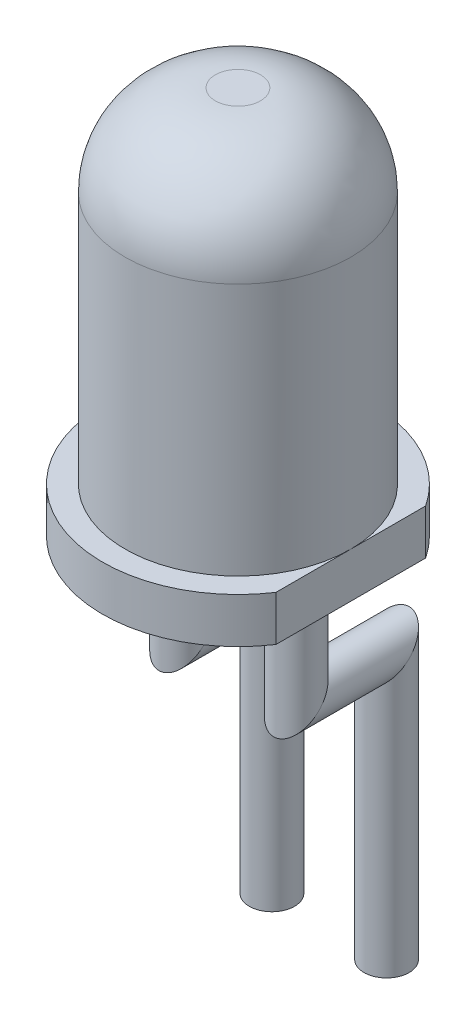
ISO-10303-21;
HEADER;
FILE_DESCRIPTION(('STEP AP214'),'2;1');
FILE_NAME('part.step','',(''),(''),'','','');
FILE_SCHEMA(('AUTOMOTIVE_DESIGN { 1 0 10303 214 1 1 1 1 }'));
ENDSEC;
DATA;
#1=APPLICATION_CONTEXT('core data for automotive mechanical design processes');
#2=APPLICATION_PROTOCOL_DEFINITION('international standard','automotive_design',2000,#1);
#3=PRODUCT_CONTEXT('',#1,'mechanical');
#4=PRODUCT('Part','Part','',(#3));
#5=PRODUCT_RELATED_PRODUCT_CATEGORY('part','',(#4));
#6=PRODUCT_DEFINITION_FORMATION('','',#4);
#7=PRODUCT_DEFINITION_CONTEXT('part definition',#1,'design');
#8=PRODUCT_DEFINITION('design','',#6,#7);
#9=PRODUCT_DEFINITION_SHAPE('','',#8);
#10=(LENGTH_UNIT() NAMED_UNIT(*) SI_UNIT(.MILLI.,.METRE.));
#11=(NAMED_UNIT(*) PLANE_ANGLE_UNIT() SI_UNIT($,.RADIAN.));
#12=(NAMED_UNIT(*) SI_UNIT($,.STERADIAN.) SOLID_ANGLE_UNIT());
#13=UNCERTAINTY_MEASURE_WITH_UNIT(LENGTH_MEASURE(1.E-05),#10,'distance_accuracy_value','');
#14=(GEOMETRIC_REPRESENTATION_CONTEXT(3) GLOBAL_UNCERTAINTY_ASSIGNED_CONTEXT((#13)) GLOBAL_UNIT_ASSIGNED_CONTEXT((#10,
#11,#12)) REPRESENTATION_CONTEXT('',''));
#15=CARTESIAN_POINT('',(0.,0.,0.));
#16=DIRECTION('',(0.,0.,1.));
#17=DIRECTION('',(1.,0.,0.));
#18=AXIS2_PLACEMENT_3D('',#15,#16,#17);
#19=CARTESIAN_POINT('',(0.,6.6,0.));
#20=DIRECTION('',(0.,1.,0.));
#21=DIRECTION('',(0.,0.,1.));
#22=AXIS2_PLACEMENT_3D('',#19,#20,#21);
#23=DEGENERATE_TOROIDAL_SURFACE('',#22,0.5,2.,.T.);
#24=CARTESIAN_POINT('',(0.,8.6,0.));
#25=DIRECTION('',(0.,1.,0.));
#26=DIRECTION('',(0.,0.,1.));
#27=AXIS2_PLACEMENT_3D('',#24,#25,#26);
#28=CIRCLE('',#27,0.5);
#29=CARTESIAN_POINT('',(0.,8.6,0.5));
#30=VERTEX_POINT('',#29);
#31=EDGE_CURVE('E86',#30,#30,#28,.T.);
#32=ORIENTED_EDGE('',*,*,#31,.F.);
#33=EDGE_LOOP('',(#32));
#34=FACE_BOUND('',#33,.T.);
#35=CARTESIAN_POINT('',(0.,6.6,0.));
#36=DIRECTION('',(0.,1.,0.));
#37=DIRECTION('',(0.,0.,1.));
#38=AXIS2_PLACEMENT_3D('',#35,#36,#37);
#39=CIRCLE('',#38,2.5);
#40=CARTESIAN_POINT('',(0.,6.6,2.5));
#41=VERTEX_POINT('',#40);
#42=EDGE_CURVE('E44',#41,#41,#39,.F.);
#43=ORIENTED_EDGE('',*,*,#42,.F.);
#44=EDGE_LOOP('',(#43));
#45=FACE_BOUND('',#44,.T.);
#46=ADVANCED_FACE('F41',(#34,#45),#23,.T.);
#47=CARTESIAN_POINT('',(0.,1.,0.));
#48=DIRECTION('',(0.,-1.,0.));
#49=DIRECTION('',(0.,0.,-1.));
#50=AXIS2_PLACEMENT_3D('',#47,#48,#49);
#51=CYLINDRICAL_SURFACE('',#50,3.);
#52=CARTESIAN_POINT('',(0.,1.,0.));
#53=DIRECTION('',(0.,1.,0.));
#54=DIRECTION('',(0.,0.,1.));
#55=AXIS2_PLACEMENT_3D('',#52,#53,#54);
#56=CIRCLE('',#55,3.);
#57=CARTESIAN_POINT('',(2.5,1.,-1.6583123951777));
#58=VERTEX_POINT('',#57);
#59=CARTESIAN_POINT('',(2.5,1.,1.6583123951777));
#60=VERTEX_POINT('',#59);
#61=EDGE_CURVE('E82',#58,#60,#56,.T.);
#62=ORIENTED_EDGE('',*,*,#61,.F.);
#63=DIRECTION('',(0.,-1.,0.));
#64=VECTOR('',#63,1.);
#65=CARTESIAN_POINT('',(2.5,1.,-1.6583123951777));
#66=LINE('',#65,#64);
#67=CARTESIAN_POINT('',(2.5,0.,-1.6583123951777));
#68=VERTEX_POINT('',#67);
#69=EDGE_CURVE('E62',#58,#68,#66,.T.);
#70=ORIENTED_EDGE('',*,*,#69,.T.);
#71=CARTESIAN_POINT('',(0.,0.,0.));
#72=DIRECTION('',(0.,1.,0.));
#73=DIRECTION('',(0.,0.,1.));
#74=AXIS2_PLACEMENT_3D('',#71,#72,#73);
#75=CIRCLE('',#74,3.);
#76=CARTESIAN_POINT('',(2.5,0.,1.6583123951777));
#77=VERTEX_POINT('',#76);
#78=EDGE_CURVE('E89',#68,#77,#75,.T.);
#79=ORIENTED_EDGE('',*,*,#78,.T.);
#80=DIRECTION('',(0.,-1.,0.));
#81=VECTOR('',#80,1.);
#82=CARTESIAN_POINT('',(2.5,1.,1.6583123951777));
#83=LINE('',#82,#81);
#84=EDGE_CURVE('E56',#77,#60,#83,.F.);
#85=ORIENTED_EDGE('',*,*,#84,.T.);
#86=EDGE_LOOP('',(#62,#70,#79,#85));
#87=FACE_BOUND('',#86,.T.);
#88=ADVANCED_FACE('F120',(#87),#51,.T.);
#89=CARTESIAN_POINT('',(0.,1.,0.));
#90=DIRECTION('',(0.,1.,0.));
#91=DIRECTION('',(0.,0.,1.));
#92=AXIS2_PLACEMENT_3D('',#89,#90,#91);
#93=PLANE('',#92);
#94=DIRECTION('',(0.,0.,1.));
#95=VECTOR('',#94,1.);
#96=CARTESIAN_POINT('',(2.5,1.,0.));
#97=LINE('',#96,#95);
#98=CARTESIAN_POINT('',(2.5,1.,0.));
#99=VERTEX_POINT('',#98);
#100=EDGE_CURVE('E69',#58,#99,#97,.T.);
#101=ORIENTED_EDGE('',*,*,#100,.F.);
#102=ORIENTED_EDGE('',*,*,#61,.T.);
#103=EDGE_CURVE('E72',#99,#60,#97,.T.);
#104=ORIENTED_EDGE('',*,*,#103,.F.);
#105=CARTESIAN_POINT('',(0.,1.,0.));
#106=DIRECTION('',(0.,1.,0.));
#107=DIRECTION('',(0.,0.,1.));
#108=AXIS2_PLACEMENT_3D('',#105,#106,#107);
#109=CIRCLE('',#108,2.5);
#110=EDGE_CURVE('E81',#99,#99,#109,.T.);
#111=ORIENTED_EDGE('',*,*,#110,.F.);
#112=EDGE_LOOP('',(#101,#102,#104,#111));
#113=FACE_BOUND('',#112,.T.);
#114=ADVANCED_FACE('F80',(#113),#93,.T.);
#115=CARTESIAN_POINT('',(0.,0.,0.));
#116=DIRECTION('',(0.,1.,0.));
#117=DIRECTION('',(0.,0.,1.));
#118=AXIS2_PLACEMENT_3D('',#115,#116,#117);
#119=PLANE('',#118);
#120=CARTESIAN_POINT('',(-1.27,0.,-0.0224020782966395));
#121=DIRECTION('',(0.,1.,0.));
#122=DIRECTION('',(0.,0.,-1.));
#123=AXIS2_PLACEMENT_3D('',#120,#121,#122);
#124=CIRCLE('',#123,0.5);
#125=CARTESIAN_POINT('',(-1.27,0.,-0.52240207829664));
#126=VERTEX_POINT('',#125);
#127=EDGE_CURVE('E111',#126,#126,#124,.F.);
#128=ORIENTED_EDGE('',*,*,#127,.F.);
#129=EDGE_LOOP('',(#128));
#130=FACE_BOUND('',#129,.T.);
#131=CARTESIAN_POINT('',(1.27,0.,-0.0224020782966395));
#132=DIRECTION('',(0.,-1.,0.));
#133=DIRECTION('',(0.,0.,-1.));
#134=AXIS2_PLACEMENT_3D('',#131,#132,#133);
#135=CIRCLE('',#134,0.5);
#136=CARTESIAN_POINT('',(1.27,0.,-0.52240207829664));
#137=VERTEX_POINT('',#136);
#138=EDGE_CURVE('E11',#137,#137,#135,.T.);
#139=ORIENTED_EDGE('',*,*,#138,.F.);
#140=EDGE_LOOP('',(#139));
#141=FACE_BOUND('',#140,.T.);
#142=ORIENTED_EDGE('',*,*,#78,.F.);
#143=DIRECTION('',(0.,0.,1.));
#144=VECTOR('',#143,1.);
#145=CARTESIAN_POINT('',(2.5,0.,0.));
#146=LINE('',#145,#144);
#147=EDGE_CURVE('E118',#68,#77,#146,.T.);
#148=ORIENTED_EDGE('',*,*,#147,.T.);
#149=EDGE_LOOP('',(#142,#148));
#150=FACE_BOUND('',#149,.T.);
#151=ADVANCED_FACE('F122',(#130,#141,#150),#119,.F.);
#152=CARTESIAN_POINT('',(0.,8.6,0.));
#153=DIRECTION('',(0.,-1.,0.));
#154=DIRECTION('',(0.,0.,-1.));
#155=AXIS2_PLACEMENT_3D('',#152,#153,#154);
#156=CYLINDRICAL_SURFACE('',#155,2.5);
#157=ORIENTED_EDGE('',*,*,#110,.T.);
#158=EDGE_LOOP('',(#157));
#159=FACE_BOUND('',#158,.T.);
#160=ORIENTED_EDGE('',*,*,#42,.T.);
#161=EDGE_LOOP('',(#160));
#162=FACE_BOUND('',#161,.T.);
#163=ADVANCED_FACE('F84',(#159,#162),#156,.T.);
#164=CARTESIAN_POINT('',(0.,8.6,0.));
#165=DIRECTION('',(0.,1.,0.));
#166=DIRECTION('',(0.,0.,1.));
#167=AXIS2_PLACEMENT_3D('',#164,#165,#166);
#168=PLANE('',#167);
#169=ORIENTED_EDGE('',*,*,#31,.T.);
#170=EDGE_LOOP('',(#169));
#171=FACE_BOUND('',#170,.T.);
#172=ADVANCED_FACE('F130',(#171),#168,.T.);
#173=CARTESIAN_POINT('',(1.27,-8.5,-2.02240207829664));
#174=DIRECTION('',(0.,-1.,0.));
#175=DIRECTION('',(0.,0.,-1.));
#176=AXIS2_PLACEMENT_3D('',#173,#174,#175);
#177=PLANE('',#176);
#178=CARTESIAN_POINT('',(1.27,-8.5,-2.02240207829664));
#179=DIRECTION('',(0.,-1.,0.));
#180=DIRECTION('',(0.,0.,-1.));
#181=AXIS2_PLACEMENT_3D('',#178,#179,#180);
#182=CIRCLE('',#181,0.5);
#183=CARTESIAN_POINT('',(1.27,-8.5,-2.52240207829664));
#184=VERTEX_POINT('',#183);
#185=EDGE_CURVE('E92',#184,#184,#182,.T.);
#186=ORIENTED_EDGE('',*,*,#185,.T.);
#187=EDGE_LOOP('',(#186));
#188=FACE_BOUND('',#187,.T.);
#189=ADVANCED_FACE('F146',(#188),#177,.T.);
#190=CARTESIAN_POINT('',(1.27,-1.8253577138737,-2.02240207829664));
#191=DIRECTION('',(0.,-1.,0.));
#192=DIRECTION('',(0.,0.,-1.));
#193=AXIS2_PLACEMENT_3D('',#190,#191,#192);
#194=CYLINDRICAL_SURFACE('',#193,0.5);
#195=CARTESIAN_POINT('',(1.27,-2.47759792170336,-2.02240207829664));
#196=DIRECTION('',(0.,-0.707106781186547,-0.707106781186547));
#197=DIRECTION('',(0.,0.707106781186548,-0.707106781186547));
#198=AXIS2_PLACEMENT_3D('',#195,#196,#197);
#199=ELLIPSE('',#198,0.707106781186548,0.5);
#200=CARTESIAN_POINT('',(1.27,-1.97759792170336,-2.52240207829664));
#201=VERTEX_POINT('',#200);
#202=EDGE_CURVE('E100',#201,#201,#199,.F.);
#203=ORIENTED_EDGE('',*,*,#202,.F.);
#204=EDGE_LOOP('',(#203));
#205=FACE_BOUND('',#204,.T.);
#206=ORIENTED_EDGE('',*,*,#185,.F.);
#207=EDGE_LOOP('',(#206));
#208=FACE_BOUND('',#207,.T.);
#209=ADVANCED_FACE('F152',(#205,#208),#194,.T.);
#210=CARTESIAN_POINT('',(1.27,-2.47759792170336,0.625357713873696));
#211=DIRECTION('',(0.,0.,-1.));
#212=DIRECTION('',(-1.,0.,0.));
#213=AXIS2_PLACEMENT_3D('',#210,#211,#212);
#214=CYLINDRICAL_SURFACE('',#213,0.5);
#215=CARTESIAN_POINT('',(1.27,-2.47759792170336,-0.0224020782966398));
#216=DIRECTION('',(0.,-0.707106781186547,-0.707106781186548));
#217=DIRECTION('',(0.,-0.707106781186548,0.707106781186547));
#218=AXIS2_PLACEMENT_3D('',#215,#216,#217);
#219=ELLIPSE('',#218,0.707106781186548,0.5);
#220=CARTESIAN_POINT('',(1.27,-2.97759792170336,0.47759792170336));
#221=VERTEX_POINT('',#220);
#222=EDGE_CURVE('E96',#221,#221,#219,.F.);
#223=ORIENTED_EDGE('',*,*,#222,.F.);
#224=EDGE_LOOP('',(#223));
#225=FACE_BOUND('',#224,.T.);
#226=ORIENTED_EDGE('',*,*,#202,.T.);
#227=EDGE_LOOP('',(#226));
#228=FACE_BOUND('',#227,.T.);
#229=ADVANCED_FACE('F158',(#225,#228),#214,.T.);
#230=CARTESIAN_POINT('',(1.27,0.,-0.0224020782966395));
#231=DIRECTION('',(0.,-1.,0.));
#232=DIRECTION('',(0.,0.,-1.));
#233=AXIS2_PLACEMENT_3D('',#230,#231,#232);
#234=CYLINDRICAL_SURFACE('',#233,0.5);
#235=ORIENTED_EDGE('',*,*,#138,.T.);
#236=EDGE_LOOP('',(#235));
#237=FACE_BOUND('',#236,.T.);
#238=ORIENTED_EDGE('',*,*,#222,.T.);
#239=EDGE_LOOP('',(#238));
#240=FACE_BOUND('',#239,.T.);
#241=ADVANCED_FACE('F148',(#237,#240),#234,.T.);
#242=CARTESIAN_POINT('',(-1.27,-8.5,-2.02240207829664));
#243=DIRECTION('',(0.,-1.,0.));
#244=DIRECTION('',(0.,0.,-1.));
#245=AXIS2_PLACEMENT_3D('',#242,#243,#244);
#246=PLANE('',#245);
#247=CARTESIAN_POINT('',(-1.27,-8.5,-2.02240207829664));
#248=DIRECTION('',(0.,1.,0.));
#249=DIRECTION('',(0.,0.,-1.));
#250=AXIS2_PLACEMENT_3D('',#247,#248,#249);
#251=CIRCLE('',#250,0.5);
#252=CARTESIAN_POINT('',(-1.27,-8.5,-2.52240207829664));
#253=VERTEX_POINT('',#252);
#254=EDGE_CURVE('E77',#253,#253,#251,.F.);
#255=ORIENTED_EDGE('',*,*,#254,.T.);
#256=EDGE_LOOP('',(#255));
#257=FACE_BOUND('',#256,.T.);
#258=ADVANCED_FACE('F157',(#257),#246,.T.);
#259=CARTESIAN_POINT('',(-1.27,-1.8253577138737,-2.02240207829664));
#260=DIRECTION('',(0.,-1.,0.));
#261=DIRECTION('',(0.,0.,-1.));
#262=AXIS2_PLACEMENT_3D('',#259,#260,#261);
#263=CYLINDRICAL_SURFACE('',#262,0.5);
#264=CARTESIAN_POINT('',(-1.27,-2.47759792170336,-2.02240207829664));
#265=DIRECTION('',(0.,-0.707106781186547,-0.707106781186547));
#266=DIRECTION('',(0.,0.707106781186548,-0.707106781186547));
#267=AXIS2_PLACEMENT_3D('',#264,#265,#266);
#268=ELLIPSE('',#267,0.707106781186548,0.5);
#269=CARTESIAN_POINT('',(-1.27,-1.97759792170336,-2.52240207829664));
#270=VERTEX_POINT('',#269);
#271=EDGE_CURVE('E108',#270,#270,#268,.F.);
#272=ORIENTED_EDGE('',*,*,#271,.F.);
#273=EDGE_LOOP('',(#272));
#274=FACE_BOUND('',#273,.T.);
#275=ORIENTED_EDGE('',*,*,#254,.F.);
#276=EDGE_LOOP('',(#275));
#277=FACE_BOUND('',#276,.T.);
#278=ADVANCED_FACE('F165',(#274,#277),#263,.T.);
#279=CARTESIAN_POINT('',(-1.27,-2.47759792170336,0.625357713873696));
#280=DIRECTION('',(0.,0.,-1.));
#281=DIRECTION('',(-1.,0.,0.));
#282=AXIS2_PLACEMENT_3D('',#279,#280,#281);
#283=CYLINDRICAL_SURFACE('',#282,0.5);
#284=CARTESIAN_POINT('',(-1.27,-2.47759792170336,-0.0224020782966398));
#285=DIRECTION('',(0.,-0.707106781186547,-0.707106781186548));
#286=DIRECTION('',(0.,-0.707106781186548,0.707106781186547));
#287=AXIS2_PLACEMENT_3D('',#284,#285,#286);
#288=ELLIPSE('',#287,0.707106781186548,0.5);
#289=CARTESIAN_POINT('',(-1.27,-2.97759792170336,0.47759792170336));
#290=VERTEX_POINT('',#289);
#291=EDGE_CURVE('E112',#290,#290,#288,.F.);
#292=ORIENTED_EDGE('',*,*,#291,.F.);
#293=EDGE_LOOP('',(#292));
#294=FACE_BOUND('',#293,.T.);
#295=ORIENTED_EDGE('',*,*,#271,.T.);
#296=EDGE_LOOP('',(#295));
#297=FACE_BOUND('',#296,.T.);
#298=ADVANCED_FACE('F209',(#294,#297),#283,.T.);
#299=CARTESIAN_POINT('',(-1.27,0.,-0.0224020782966395));
#300=DIRECTION('',(0.,-1.,0.));
#301=DIRECTION('',(0.,0.,-1.));
#302=AXIS2_PLACEMENT_3D('',#299,#300,#301);
#303=CYLINDRICAL_SURFACE('',#302,0.5);
#304=ORIENTED_EDGE('',*,*,#127,.T.);
#305=EDGE_LOOP('',(#304));
#306=FACE_BOUND('',#305,.T.);
#307=ORIENTED_EDGE('',*,*,#291,.T.);
#308=EDGE_LOOP('',(#307));
#309=FACE_BOUND('',#308,.T.);
#310=ADVANCED_FACE('F155',(#306,#309),#303,.T.);
#311=CARTESIAN_POINT('',(2.5,0.,0.));
#312=DIRECTION('',(-1.,0.,0.));
#313=DIRECTION('',(0.,0.,1.));
#314=AXIS2_PLACEMENT_3D('',#311,#312,#313);
#315=PLANE('',#314);
#316=ORIENTED_EDGE('',*,*,#100,.T.);
#317=ORIENTED_EDGE('',*,*,#103,.T.);
#318=ORIENTED_EDGE('',*,*,#84,.F.);
#319=ORIENTED_EDGE('',*,*,#147,.F.);
#320=ORIENTED_EDGE('',*,*,#69,.F.);
#321=EDGE_LOOP('',(#316,#317,#318,#319,#320));
#322=FACE_BOUND('',#321,.T.);
#323=ADVANCED_FACE('F71',(#322),#315,.F.);
#324=CLOSED_SHELL('',(#46,#88,#114,#151,#163,#172,#189,#209,#229,#241,#258,#278,#298,#310,#323));
#325=MANIFOLD_SOLID_BREP('B2',#324);
#326=ADVANCED_BREP_SHAPE_REPRESENTATION('',(#18,#325),#14);
#327=SHAPE_DEFINITION_REPRESENTATION(#9,#326);
ENDSEC;
END-ISO-10303-21;
